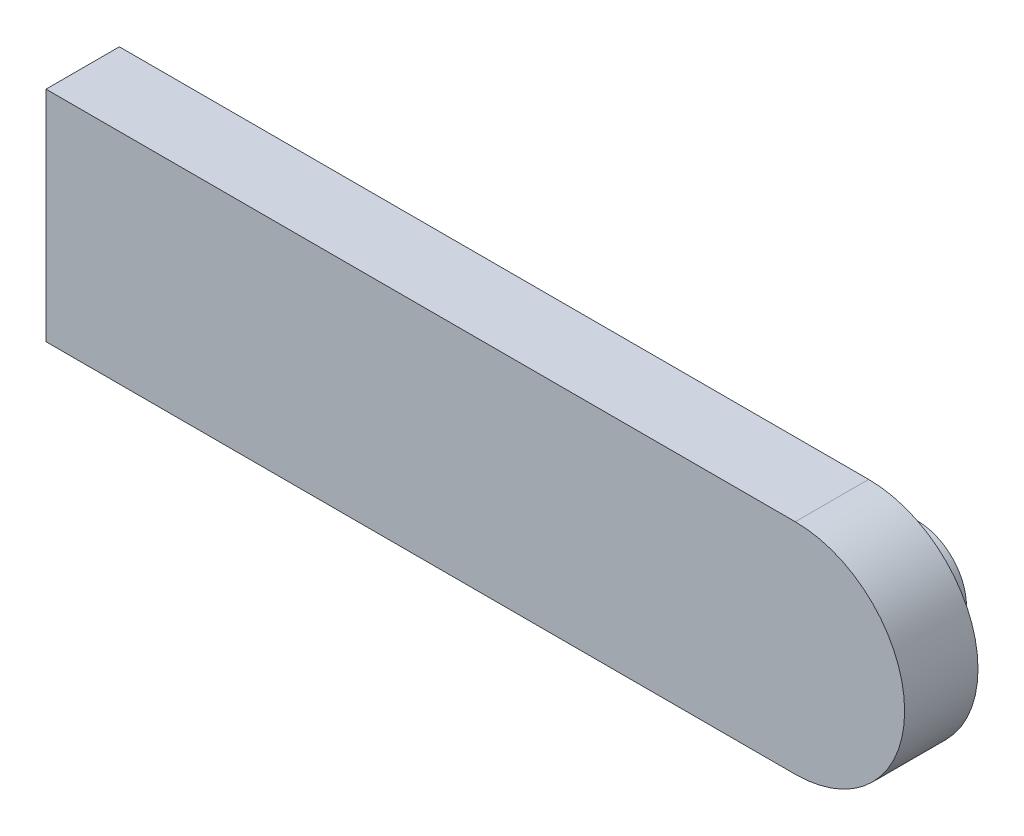
ISO-10303-21;
HEADER;
FILE_DESCRIPTION(('STEP AP214'),'2;1');
FILE_NAME('part.step','',(''),(''),'','','');
FILE_SCHEMA(('AUTOMOTIVE_DESIGN { 1 0 10303 214 1 1 1 1 }'));
ENDSEC;
DATA;
#1=APPLICATION_CONTEXT('core data for automotive mechanical design processes');
#2=APPLICATION_PROTOCOL_DEFINITION('international standard','automotive_design',2000,#1);
#3=PRODUCT_CONTEXT('',#1,'mechanical');
#4=PRODUCT('Part','Part','',(#3));
#5=PRODUCT_RELATED_PRODUCT_CATEGORY('part','',(#4));
#6=PRODUCT_DEFINITION_FORMATION('','',#4);
#7=PRODUCT_DEFINITION_CONTEXT('part definition',#1,'design');
#8=PRODUCT_DEFINITION('design','',#6,#7);
#9=PRODUCT_DEFINITION_SHAPE('','',#8);
#10=(LENGTH_UNIT() NAMED_UNIT(*) SI_UNIT(.MILLI.,.METRE.));
#11=(NAMED_UNIT(*) PLANE_ANGLE_UNIT() SI_UNIT($,.RADIAN.));
#12=(NAMED_UNIT(*) SI_UNIT($,.STERADIAN.) SOLID_ANGLE_UNIT());
#13=UNCERTAINTY_MEASURE_WITH_UNIT(LENGTH_MEASURE(1.E-05),#10,'distance_accuracy_value','');
#14=(GEOMETRIC_REPRESENTATION_CONTEXT(3) GLOBAL_UNCERTAINTY_ASSIGNED_CONTEXT((#13)) GLOBAL_UNIT_ASSIGNED_CONTEXT((#10,
#11,#12)) REPRESENTATION_CONTEXT('',''));
#15=CARTESIAN_POINT('',(0.,0.,0.));
#16=DIRECTION('',(0.,0.,1.));
#17=DIRECTION('',(1.,0.,0.));
#18=AXIS2_PLACEMENT_3D('',#15,#16,#17);
#19=CARTESIAN_POINT('',(0.,44.73,15.));
#20=DIRECTION('',(0.,-1.,0.));
#21=DIRECTION('',(0.,0.,-1.));
#22=AXIS2_PLACEMENT_3D('',#19,#20,#21);
#23=PLANE('',#22);
#24=DIRECTION('',(0.,0.,1.));
#25=VECTOR('',#24,1.);
#26=CARTESIAN_POINT('',(153.21162338788,44.73,-0.000999999999999265));
#27=LINE('',#26,#25);
#28=CARTESIAN_POINT('',(153.21162338788,44.73,0.));
#29=VERTEX_POINT('',#28);
#30=CARTESIAN_POINT('',(153.21162338788,44.73,15.));
#31=VERTEX_POINT('',#30);
#32=EDGE_CURVE('E91',#29,#31,#27,.T.);
#33=ORIENTED_EDGE('',*,*,#32,.F.);
#34=DIRECTION('',(-1.,0.,0.));
#35=VECTOR('',#34,1.);
#36=CARTESIAN_POINT('',(0.,44.73,0.));
#37=LINE('',#36,#35);
#38=CARTESIAN_POINT('',(0.,44.73,0.));
#39=VERTEX_POINT('',#38);
#40=EDGE_CURVE('E86',#29,#39,#37,.T.);
#41=ORIENTED_EDGE('',*,*,#40,.T.);
#42=DIRECTION('',(0.,0.,-1.));
#43=VECTOR('',#42,1.);
#44=CARTESIAN_POINT('',(0.,44.73,15.));
#45=LINE('',#44,#43);
#46=CARTESIAN_POINT('',(0.,44.73,15.));
#47=VERTEX_POINT('',#46);
#48=EDGE_CURVE('E56',#47,#39,#45,.T.);
#49=ORIENTED_EDGE('',*,*,#48,.F.);
#50=DIRECTION('',(-1.,0.,0.));
#51=VECTOR('',#50,1.);
#52=CARTESIAN_POINT('',(0.,44.73,15.));
#53=LINE('',#52,#51);
#54=EDGE_CURVE('E72',#31,#47,#53,.T.);
#55=ORIENTED_EDGE('',*,*,#54,.F.);
#56=EDGE_LOOP('',(#33,#41,#49,#55));
#57=FACE_BOUND('',#56,.T.);
#58=ADVANCED_FACE('F47',(#57),#23,.F.);
#59=CARTESIAN_POINT('',(0.,0.,15.));
#60=DIRECTION('',(0.,0.,-1.));
#61=DIRECTION('',(-1.,0.,0.));
#62=AXIS2_PLACEMENT_3D('',#59,#60,#61);
#63=PLANE('',#62);
#64=CARTESIAN_POINT('',(153.21162338788,22.365,15.));
#65=DIRECTION('',(0.,0.,1.));
#66=DIRECTION('',(1.,0.,0.));
#67=AXIS2_PLACEMENT_3D('',#64,#65,#66);
#68=CIRCLE('',#67,22.365);
#69=CARTESIAN_POINT('',(153.21162338788,0.,15.));
#70=VERTEX_POINT('',#69);
#71=EDGE_CURVE('E121',#70,#31,#68,.T.);
#72=ORIENTED_EDGE('',*,*,#71,.T.);
#73=ORIENTED_EDGE('',*,*,#54,.T.);
#74=DIRECTION('',(0.,-1.,0.));
#75=VECTOR('',#74,1.);
#76=CARTESIAN_POINT('',(0.,0.,15.));
#77=LINE('',#76,#75);
#78=CARTESIAN_POINT('',(0.,0.,15.));
#79=VERTEX_POINT('',#78);
#80=EDGE_CURVE('E95',#47,#79,#77,.T.);
#81=ORIENTED_EDGE('',*,*,#80,.T.);
#82=DIRECTION('',(1.,0.,0.));
#83=VECTOR('',#82,1.);
#84=CARTESIAN_POINT('',(0.,0.,15.));
#85=LINE('',#84,#83);
#86=EDGE_CURVE('E114',#79,#70,#85,.T.);
#87=ORIENTED_EDGE('',*,*,#86,.T.);
#88=EDGE_LOOP('',(#72,#73,#81,#87));
#89=FACE_BOUND('',#88,.T.);
#90=ADVANCED_FACE('F199',(#89),#63,.F.);
#91=CARTESIAN_POINT('',(0.,0.,0.));
#92=DIRECTION('',(0.,0.,-1.));
#93=DIRECTION('',(-1.,0.,0.));
#94=AXIS2_PLACEMENT_3D('',#91,#92,#93);
#95=PLANE('',#94);
#96=CARTESIAN_POINT('',(153.21162338788,22.365,0.));
#97=DIRECTION('',(0.,0.,-1.));
#98=DIRECTION('',(-1.,0.,0.));
#99=AXIS2_PLACEMENT_3D('',#96,#97,#98);
#100=CIRCLE('',#99,10.);
#101=CARTESIAN_POINT('',(143.21162338788,22.365,0.));
#102=VERTEX_POINT('',#101);
#103=EDGE_CURVE('E129',#102,#102,#100,.T.);
#104=ORIENTED_EDGE('',*,*,#103,.F.);
#105=EDGE_LOOP('',(#104));
#106=FACE_BOUND('',#105,.T.);
#107=ORIENTED_EDGE('',*,*,#40,.F.);
#108=CARTESIAN_POINT('',(153.21162338788,22.365,0.));
#109=DIRECTION('',(0.,0.,-1.));
#110=DIRECTION('',(-1.,0.,0.));
#111=AXIS2_PLACEMENT_3D('',#108,#109,#110);
#112=CIRCLE('',#111,22.365);
#113=CARTESIAN_POINT('',(153.21162338788,0.,0.));
#114=VERTEX_POINT('',#113);
#115=EDGE_CURVE('E125',#114,#29,#112,.F.);
#116=ORIENTED_EDGE('',*,*,#115,.F.);
#117=DIRECTION('',(1.,0.,0.));
#118=VECTOR('',#117,1.);
#119=CARTESIAN_POINT('',(0.,0.,0.));
#120=LINE('',#119,#118);
#121=CARTESIAN_POINT('',(0.,0.,0.));
#122=VERTEX_POINT('',#121);
#123=EDGE_CURVE('E96',#122,#114,#120,.T.);
#124=ORIENTED_EDGE('',*,*,#123,.F.);
#125=DIRECTION('',(0.,-1.,0.));
#126=VECTOR('',#125,1.);
#127=CARTESIAN_POINT('',(0.,0.,0.));
#128=LINE('',#127,#126);
#129=EDGE_CURVE('E101',#39,#122,#128,.T.);
#130=ORIENTED_EDGE('',*,*,#129,.F.);
#131=EDGE_LOOP('',(#107,#116,#124,#130));
#132=FACE_BOUND('',#131,.T.);
#133=ADVANCED_FACE('F103',(#106,#132),#95,.T.);
#134=CARTESIAN_POINT('',(0.,0.,15.));
#135=DIRECTION('',(1.,0.,0.));
#136=DIRECTION('',(0.,0.,-1.));
#137=AXIS2_PLACEMENT_3D('',#134,#135,#136);
#138=PLANE('',#137);
#139=ORIENTED_EDGE('',*,*,#129,.T.);
#140=DIRECTION('',(0.,0.,-1.));
#141=VECTOR('',#140,1.);
#142=CARTESIAN_POINT('',(0.,0.,15.));
#143=LINE('',#142,#141);
#144=EDGE_CURVE('E11',#79,#122,#143,.T.);
#145=ORIENTED_EDGE('',*,*,#144,.F.);
#146=ORIENTED_EDGE('',*,*,#80,.F.);
#147=ORIENTED_EDGE('',*,*,#48,.T.);
#148=EDGE_LOOP('',(#139,#145,#146,#147));
#149=FACE_BOUND('',#148,.T.);
#150=ADVANCED_FACE('F49',(#149),#138,.F.);
#151=CARTESIAN_POINT('',(0.,0.,15.));
#152=DIRECTION('',(0.,1.,0.));
#153=DIRECTION('',(0.,0.,1.));
#154=AXIS2_PLACEMENT_3D('',#151,#152,#153);
#155=PLANE('',#154);
#156=ORIENTED_EDGE('',*,*,#123,.T.);
#157=DIRECTION('',(0.,0.,1.));
#158=VECTOR('',#157,1.);
#159=CARTESIAN_POINT('',(153.21162338788,0.,-0.000999999999999265));
#160=LINE('',#159,#158);
#161=EDGE_CURVE('E63',#114,#70,#160,.T.);
#162=ORIENTED_EDGE('',*,*,#161,.T.);
#163=ORIENTED_EDGE('',*,*,#86,.F.);
#164=ORIENTED_EDGE('',*,*,#144,.T.);
#165=EDGE_LOOP('',(#156,#162,#163,#164));
#166=FACE_BOUND('',#165,.T.);
#167=ADVANCED_FACE('F205',(#166),#155,.F.);
#168=CARTESIAN_POINT('',(153.21162338788,22.365,-0.000999999999999265));
#169=DIRECTION('',(0.,0.,1.));
#170=DIRECTION('',(1.,0.,0.));
#171=AXIS2_PLACEMENT_3D('',#168,#169,#170);
#172=CYLINDRICAL_SURFACE('',#171,22.365);
#173=ORIENTED_EDGE('',*,*,#115,.T.);
#174=ORIENTED_EDGE('',*,*,#32,.T.);
#175=ORIENTED_EDGE('',*,*,#71,.F.);
#176=ORIENTED_EDGE('',*,*,#161,.F.);
#177=EDGE_LOOP('',(#173,#174,#175,#176));
#178=FACE_BOUND('',#177,.T.);
#179=ADVANCED_FACE('F194',(#178),#172,.T.);
#180=CARTESIAN_POINT('',(153.21162338788,22.365,-10.));
#181=DIRECTION('',(0.,0.,1.));
#182=DIRECTION('',(1.,0.,0.));
#183=AXIS2_PLACEMENT_3D('',#180,#181,#182);
#184=CYLINDRICAL_SURFACE('',#183,10.);
#185=CARTESIAN_POINT('',(153.21162338788,22.365,-10.));
#186=DIRECTION('',(0.,0.,-1.));
#187=DIRECTION('',(-1.,0.,0.));
#188=AXIS2_PLACEMENT_3D('',#185,#186,#187);
#189=CIRCLE('',#188,10.);
#190=CARTESIAN_POINT('',(143.21162338788,22.365,-10.));
#191=VERTEX_POINT('',#190);
#192=EDGE_CURVE('E128',#191,#191,#189,.T.);
#193=ORIENTED_EDGE('',*,*,#192,.F.);
#194=EDGE_LOOP('',(#193));
#195=FACE_BOUND('',#194,.T.);
#196=ORIENTED_EDGE('',*,*,#103,.T.);
#197=EDGE_LOOP('',(#196));
#198=FACE_BOUND('',#197,.T.);
#199=ADVANCED_FACE('F182',(#195,#198),#184,.T.);
#200=CARTESIAN_POINT('',(0.,0.,-10.));
#201=DIRECTION('',(0.,0.,-1.));
#202=DIRECTION('',(-1.,0.,0.));
#203=AXIS2_PLACEMENT_3D('',#200,#201,#202);
#204=PLANE('',#203);
#205=CARTESIAN_POINT('',(153.21162338788,29.365,-10.));
#206=DIRECTION('',(0.,0.,-1.));
#207=DIRECTION('',(-1.,0.,0.));
#208=AXIS2_PLACEMENT_3D('',#205,#206,#207);
#209=CIRCLE('',#208,0.999999999999998);
#210=CARTESIAN_POINT('',(152.21162338788,29.365,-10.));
#211=VERTEX_POINT('',#210);
#212=EDGE_CURVE('E161',#211,#211,#209,.T.);
#213=ORIENTED_EDGE('',*,*,#212,.F.);
#214=EDGE_LOOP('',(#213));
#215=FACE_BOUND('',#214,.T.);
#216=CARTESIAN_POINT('',(146.21162338788,22.3650000000001,-10.));
#217=DIRECTION('',(0.,0.,-1.));
#218=DIRECTION('',(-1.,0.,0.));
#219=AXIS2_PLACEMENT_3D('',#216,#217,#218);
#220=CIRCLE('',#219,0.999999999999998);
#221=CARTESIAN_POINT('',(145.21162338788,22.3650000000001,-10.));
#222=VERTEX_POINT('',#221);
#223=EDGE_CURVE('E157',#222,#222,#220,.T.);
#224=ORIENTED_EDGE('',*,*,#223,.F.);
#225=EDGE_LOOP('',(#224));
#226=FACE_BOUND('',#225,.T.);
#227=CARTESIAN_POINT('',(153.21162338788,15.365,-10.));
#228=DIRECTION('',(0.,0.,-1.));
#229=DIRECTION('',(-1.,0.,0.));
#230=AXIS2_PLACEMENT_3D('',#227,#228,#229);
#231=CIRCLE('',#230,0.999999999999996);
#232=CARTESIAN_POINT('',(152.21162338788,15.365,-10.));
#233=VERTEX_POINT('',#232);
#234=EDGE_CURVE('E149',#233,#233,#231,.T.);
#235=ORIENTED_EDGE('',*,*,#234,.F.);
#236=EDGE_LOOP('',(#235));
#237=FACE_BOUND('',#236,.T.);
#238=CARTESIAN_POINT('',(160.21162338788,22.365,-10.));
#239=DIRECTION('',(0.,0.,-1.));
#240=DIRECTION('',(-1.,0.,0.));
#241=AXIS2_PLACEMENT_3D('',#238,#239,#240);
#242=CIRCLE('',#241,0.99999999999999);
#243=CARTESIAN_POINT('',(159.21162338788,22.365,-10.));
#244=VERTEX_POINT('',#243);
#245=EDGE_CURVE('E141',#244,#244,#242,.T.);
#246=ORIENTED_EDGE('',*,*,#245,.F.);
#247=EDGE_LOOP('',(#246));
#248=FACE_BOUND('',#247,.T.);
#249=ORIENTED_EDGE('',*,*,#192,.T.);
#250=EDGE_LOOP('',(#249));
#251=FACE_BOUND('',#250,.T.);
#252=ADVANCED_FACE('F178',(#215,#226,#237,#248,#251),#204,.T.);
#253=CARTESIAN_POINT('',(160.21162338788,22.365,-5.));
#254=DIRECTION('',(0.,0.,-1.));
#255=DIRECTION('',(-1.,0.,0.));
#256=AXIS2_PLACEMENT_3D('',#253,#254,#255);
#257=CYLINDRICAL_SURFACE('',#256,0.99999999999999);
#258=CARTESIAN_POINT('',(160.21162338788,22.365,-5.));
#259=DIRECTION('',(0.,0.,-1.));
#260=DIRECTION('',(-1.,0.,0.));
#261=AXIS2_PLACEMENT_3D('',#258,#259,#260);
#262=CIRCLE('',#261,0.99999999999999);
#263=CARTESIAN_POINT('',(159.21162338788,22.365,-5.));
#264=VERTEX_POINT('',#263);
#265=EDGE_CURVE('E137',#264,#264,#262,.T.);
#266=ORIENTED_EDGE('',*,*,#265,.F.);
#267=EDGE_LOOP('',(#266));
#268=FACE_BOUND('',#267,.T.);
#269=ORIENTED_EDGE('',*,*,#245,.T.);
#270=EDGE_LOOP('',(#269));
#271=FACE_BOUND('',#270,.T.);
#272=ADVANCED_FACE('F181',(#268,#271),#257,.F.);
#273=CARTESIAN_POINT('',(160.21162338788,22.365,-5.));
#274=DIRECTION('',(0.,0.,-1.));
#275=DIRECTION('',(-1.,0.,0.));
#276=AXIS2_PLACEMENT_3D('',#273,#274,#275);
#277=PLANE('',#276);
#278=ORIENTED_EDGE('',*,*,#265,.T.);
#279=EDGE_LOOP('',(#278));
#280=FACE_BOUND('',#279,.T.);
#281=ADVANCED_FACE('F223',(#280),#277,.T.);
#282=CARTESIAN_POINT('',(153.21162338788,15.365,-5.));
#283=DIRECTION('',(0.,0.,-1.));
#284=DIRECTION('',(-1.,0.,0.));
#285=AXIS2_PLACEMENT_3D('',#282,#283,#284);
#286=CYLINDRICAL_SURFACE('',#285,0.999999999999996);
#287=CARTESIAN_POINT('',(153.21162338788,15.365,-5.));
#288=DIRECTION('',(0.,0.,-1.));
#289=DIRECTION('',(-1.,0.,0.));
#290=AXIS2_PLACEMENT_3D('',#287,#288,#289);
#291=CIRCLE('',#290,0.999999999999996);
#292=CARTESIAN_POINT('',(152.21162338788,15.365,-5.));
#293=VERTEX_POINT('',#292);
#294=EDGE_CURVE('E145',#293,#293,#291,.T.);
#295=ORIENTED_EDGE('',*,*,#294,.F.);
#296=EDGE_LOOP('',(#295));
#297=FACE_BOUND('',#296,.T.);
#298=ORIENTED_EDGE('',*,*,#234,.T.);
#299=EDGE_LOOP('',(#298));
#300=FACE_BOUND('',#299,.T.);
#301=ADVANCED_FACE('F226',(#297,#300),#286,.F.);
#302=CARTESIAN_POINT('',(153.21162338788,15.365,-5.));
#303=DIRECTION('',(0.,0.,-1.));
#304=DIRECTION('',(-1.,0.,0.));
#305=AXIS2_PLACEMENT_3D('',#302,#303,#304);
#306=PLANE('',#305);
#307=ORIENTED_EDGE('',*,*,#294,.T.);
#308=EDGE_LOOP('',(#307));
#309=FACE_BOUND('',#308,.T.);
#310=ADVANCED_FACE('F231',(#309),#306,.T.);
#311=CARTESIAN_POINT('',(146.21162338788,22.3650000000001,-5.));
#312=DIRECTION('',(0.,0.,-1.));
#313=DIRECTION('',(-1.,0.,0.));
#314=AXIS2_PLACEMENT_3D('',#311,#312,#313);
#315=CYLINDRICAL_SURFACE('',#314,0.999999999999998);
#316=CARTESIAN_POINT('',(146.21162338788,22.3650000000001,-5.));
#317=DIRECTION('',(0.,0.,-1.));
#318=DIRECTION('',(-1.,0.,0.));
#319=AXIS2_PLACEMENT_3D('',#316,#317,#318);
#320=CIRCLE('',#319,0.999999999999998);
#321=CARTESIAN_POINT('',(145.21162338788,22.3650000000001,-5.));
#322=VERTEX_POINT('',#321);
#323=EDGE_CURVE('E153',#322,#322,#320,.T.);
#324=ORIENTED_EDGE('',*,*,#323,.F.);
#325=EDGE_LOOP('',(#324));
#326=FACE_BOUND('',#325,.T.);
#327=ORIENTED_EDGE('',*,*,#223,.T.);
#328=EDGE_LOOP('',(#327));
#329=FACE_BOUND('',#328,.T.);
#330=ADVANCED_FACE('F234',(#326,#329),#315,.F.);
#331=CARTESIAN_POINT('',(146.21162338788,22.3650000000001,-5.));
#332=DIRECTION('',(0.,0.,-1.));
#333=DIRECTION('',(-1.,0.,0.));
#334=AXIS2_PLACEMENT_3D('',#331,#332,#333);
#335=PLANE('',#334);
#336=ORIENTED_EDGE('',*,*,#323,.T.);
#337=EDGE_LOOP('',(#336));
#338=FACE_BOUND('',#337,.T.);
#339=ADVANCED_FACE('F174',(#338),#335,.T.);
#340=CARTESIAN_POINT('',(153.21162338788,29.365,-5.));
#341=DIRECTION('',(0.,0.,-1.));
#342=DIRECTION('',(-1.,0.,0.));
#343=AXIS2_PLACEMENT_3D('',#340,#341,#342);
#344=CYLINDRICAL_SURFACE('',#343,0.999999999999998);
#345=CARTESIAN_POINT('',(153.21162338788,29.365,-5.));
#346=DIRECTION('',(0.,0.,-1.));
#347=DIRECTION('',(-1.,0.,0.));
#348=AXIS2_PLACEMENT_3D('',#345,#346,#347);
#349=CIRCLE('',#348,0.999999999999998);
#350=CARTESIAN_POINT('',(152.21162338788,29.365,-5.));
#351=VERTEX_POINT('',#350);
#352=EDGE_CURVE('E133',#351,#351,#349,.T.);
#353=ORIENTED_EDGE('',*,*,#352,.F.);
#354=EDGE_LOOP('',(#353));
#355=FACE_BOUND('',#354,.T.);
#356=ORIENTED_EDGE('',*,*,#212,.T.);
#357=EDGE_LOOP('',(#356));
#358=FACE_BOUND('',#357,.T.);
#359=ADVANCED_FACE('F171',(#355,#358),#344,.F.);
#360=CARTESIAN_POINT('',(153.21162338788,29.365,-5.));
#361=DIRECTION('',(0.,0.,-1.));
#362=DIRECTION('',(-1.,0.,0.));
#363=AXIS2_PLACEMENT_3D('',#360,#361,#362);
#364=PLANE('',#363);
#365=ORIENTED_EDGE('',*,*,#352,.T.);
#366=EDGE_LOOP('',(#365));
#367=FACE_BOUND('',#366,.T.);
#368=ADVANCED_FACE('F169',(#367),#364,.T.);
#369=CLOSED_SHELL('',(#58,#90,#133,#150,#167,#179,#199,#252,#272,#281,#301,#310,#330,#339,#359,#368));
#370=MANIFOLD_SOLID_BREP('B2',#369);
#371=ADVANCED_BREP_SHAPE_REPRESENTATION('',(#18,#370),#14);
#372=SHAPE_DEFINITION_REPRESENTATION(#9,#371);
ENDSEC;
END-ISO-10303-21;
